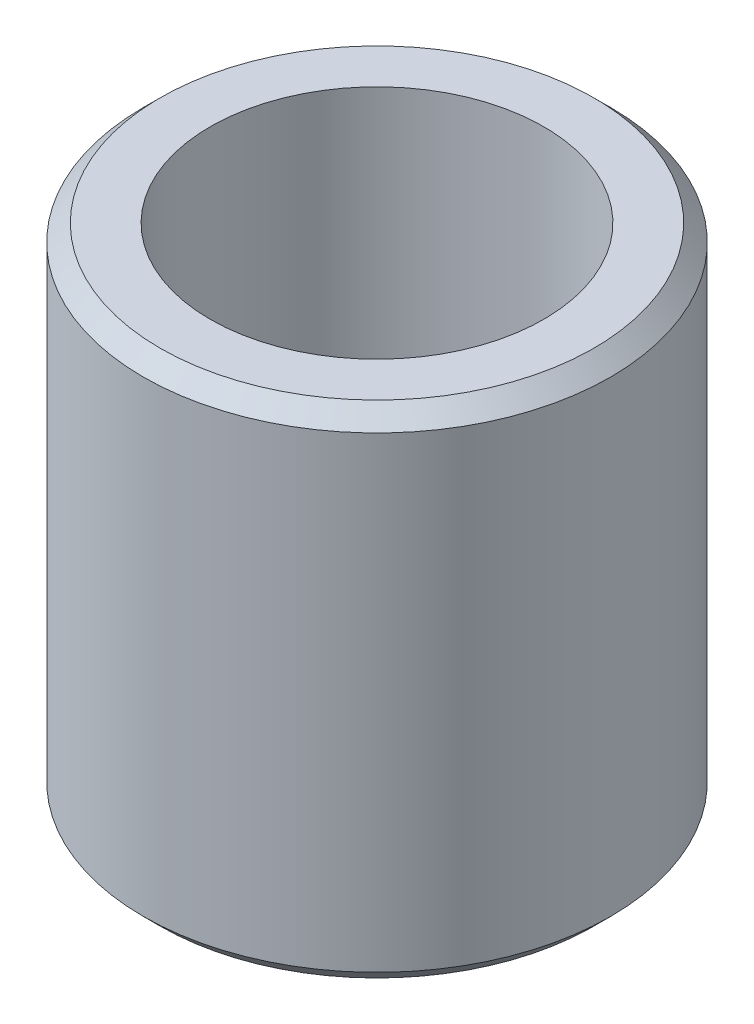
ISO-10303-21;
HEADER;
FILE_DESCRIPTION(('STEP AP214'),'2;1');
FILE_NAME('part.step','',(''),(''),'','','');
FILE_SCHEMA(('AUTOMOTIVE_DESIGN { 1 0 10303 214 1 1 1 1 }'));
ENDSEC;
DATA;
#1=APPLICATION_CONTEXT('core data for automotive mechanical design processes');
#2=APPLICATION_PROTOCOL_DEFINITION('international standard','automotive_design',2000,#1);
#3=PRODUCT_CONTEXT('',#1,'mechanical');
#4=PRODUCT('Part','Part','',(#3));
#5=PRODUCT_RELATED_PRODUCT_CATEGORY('part','',(#4));
#6=PRODUCT_DEFINITION_FORMATION('','',#4);
#7=PRODUCT_DEFINITION_CONTEXT('part definition',#1,'design');
#8=PRODUCT_DEFINITION('design','',#6,#7);
#9=PRODUCT_DEFINITION_SHAPE('','',#8);
#10=(LENGTH_UNIT() NAMED_UNIT(*) SI_UNIT(.MILLI.,.METRE.));
#11=(NAMED_UNIT(*) PLANE_ANGLE_UNIT() SI_UNIT($,.RADIAN.));
#12=(NAMED_UNIT(*) SI_UNIT($,.STERADIAN.) SOLID_ANGLE_UNIT());
#13=UNCERTAINTY_MEASURE_WITH_UNIT(LENGTH_MEASURE(1.E-05),#10,'distance_accuracy_value','');
#14=(GEOMETRIC_REPRESENTATION_CONTEXT(3) GLOBAL_UNCERTAINTY_ASSIGNED_CONTEXT((#13)) GLOBAL_UNIT_ASSIGNED_CONTEXT((#10,
#11,#12)) REPRESENTATION_CONTEXT('',''));
#15=CARTESIAN_POINT('',(0.,0.,0.));
#16=DIRECTION('',(0.,0.,1.));
#17=DIRECTION('',(1.,0.,0.));
#18=AXIS2_PLACEMENT_3D('',#15,#16,#17);
#19=CARTESIAN_POINT('',(0.,7.5,0.));
#20=DIRECTION('',(0.,1.,0.));
#21=DIRECTION('',(0.,0.,1.));
#22=AXIS2_PLACEMENT_3D('',#19,#20,#21);
#23=PLANE('',#22);
#24=CARTESIAN_POINT('',(0.,7.5,0.));
#25=DIRECTION('',(0.,1.,0.));
#26=DIRECTION('',(0.,0.,1.));
#27=AXIS2_PLACEMENT_3D('',#24,#25,#26);
#28=CIRCLE('',#27,6.5);
#29=CARTESIAN_POINT('',(0.,7.5,6.5));
#30=VERTEX_POINT('',#29);
#31=EDGE_CURVE('E10',#30,#30,#28,.T.);
#32=ORIENTED_EDGE('',*,*,#31,.T.);
#33=EDGE_LOOP('',(#32));
#34=FACE_BOUND('',#33,.T.);
#35=CARTESIAN_POINT('',(0.,7.5,0.));
#36=DIRECTION('',(0.,1.,0.));
#37=DIRECTION('',(0.,0.,1.));
#38=AXIS2_PLACEMENT_3D('',#35,#36,#37);
#39=CIRCLE('',#38,5.);
#40=CARTESIAN_POINT('',(0.,7.5,5.));
#41=VERTEX_POINT('',#40);
#42=EDGE_CURVE('E67',#41,#41,#39,.T.);
#43=ORIENTED_EDGE('',*,*,#42,.F.);
#44=EDGE_LOOP('',(#43));
#45=FACE_BOUND('',#44,.T.);
#46=ADVANCED_FACE('F44',(#34,#45),#23,.T.);
#47=CARTESIAN_POINT('',(0.,-7.5,0.));
#48=DIRECTION('',(0.,1.,0.));
#49=DIRECTION('',(0.,0.,1.));
#50=AXIS2_PLACEMENT_3D('',#47,#48,#49);
#51=PLANE('',#50);
#52=CARTESIAN_POINT('',(0.,-7.5,0.));
#53=DIRECTION('',(0.,1.,0.));
#54=DIRECTION('',(0.,0.,1.));
#55=AXIS2_PLACEMENT_3D('',#52,#53,#54);
#56=CIRCLE('',#55,6.5);
#57=CARTESIAN_POINT('',(0.,-7.5,6.5));
#58=VERTEX_POINT('',#57);
#59=EDGE_CURVE('E53',#58,#58,#56,.F.);
#60=ORIENTED_EDGE('',*,*,#59,.T.);
#61=EDGE_LOOP('',(#60));
#62=FACE_BOUND('',#61,.T.);
#63=CARTESIAN_POINT('',(0.,-7.5,0.));
#64=DIRECTION('',(0.,1.,0.));
#65=DIRECTION('',(0.,0.,1.));
#66=AXIS2_PLACEMENT_3D('',#63,#64,#65);
#67=CIRCLE('',#66,5.);
#68=CARTESIAN_POINT('',(0.,-7.5,5.));
#69=VERTEX_POINT('',#68);
#70=EDGE_CURVE('E72',#69,#69,#67,.T.);
#71=ORIENTED_EDGE('',*,*,#70,.T.);
#72=EDGE_LOOP('',(#71));
#73=FACE_BOUND('',#72,.T.);
#74=ADVANCED_FACE('F85',(#62,#73),#51,.F.);
#75=CARTESIAN_POINT('',(0.,7.5,0.));
#76=DIRECTION('',(0.,-1.,0.));
#77=DIRECTION('',(0.,0.,-1.));
#78=AXIS2_PLACEMENT_3D('',#75,#76,#77);
#79=CYLINDRICAL_SURFACE('',#78,7.);
#80=CARTESIAN_POINT('',(0.,-7.,0.));
#81=DIRECTION('',(0.,1.,0.));
#82=DIRECTION('',(0.,0.,1.));
#83=AXIS2_PLACEMENT_3D('',#80,#81,#82);
#84=CIRCLE('',#83,7.);
#85=CARTESIAN_POINT('',(0.,-7.,7.));
#86=VERTEX_POINT('',#85);
#87=EDGE_CURVE('E56',#86,#86,#84,.T.);
#88=ORIENTED_EDGE('',*,*,#87,.T.);
#89=EDGE_LOOP('',(#88));
#90=FACE_BOUND('',#89,.T.);
#91=CARTESIAN_POINT('',(0.,7.,0.));
#92=DIRECTION('',(0.,1.,0.));
#93=DIRECTION('',(0.,0.,1.));
#94=AXIS2_PLACEMENT_3D('',#91,#92,#93);
#95=CIRCLE('',#94,7.);
#96=CARTESIAN_POINT('',(0.,7.,7.));
#97=VERTEX_POINT('',#96);
#98=EDGE_CURVE('E61',#97,#97,#95,.F.);
#99=ORIENTED_EDGE('',*,*,#98,.T.);
#100=EDGE_LOOP('',(#99));
#101=FACE_BOUND('',#100,.T.);
#102=ADVANCED_FACE('F90',(#90,#101),#79,.T.);
#103=CARTESIAN_POINT('',(0.,7.5,0.));
#104=DIRECTION('',(0.,-1.,0.));
#105=DIRECTION('',(0.,0.,-1.));
#106=AXIS2_PLACEMENT_3D('',#103,#104,#105);
#107=CYLINDRICAL_SURFACE('',#106,5.);
#108=ORIENTED_EDGE('',*,*,#42,.T.);
#109=EDGE_LOOP('',(#108));
#110=FACE_BOUND('',#109,.T.);
#111=ORIENTED_EDGE('',*,*,#70,.F.);
#112=EDGE_LOOP('',(#111));
#113=FACE_BOUND('',#112,.T.);
#114=ADVANCED_FACE('F76',(#110,#113),#107,.F.);
#115=CARTESIAN_POINT('',(0.,-7.,0.));
#116=DIRECTION('',(0.,1.,0.));
#117=DIRECTION('',(0.,0.,1.));
#118=AXIS2_PLACEMENT_3D('',#115,#116,#117);
#119=CONICAL_SURFACE('',#118,7.,0.785398163397447);
#120=ORIENTED_EDGE('',*,*,#59,.F.);
#121=EDGE_LOOP('',(#120));
#122=FACE_BOUND('',#121,.T.);
#123=ORIENTED_EDGE('',*,*,#87,.F.);
#124=EDGE_LOOP('',(#123));
#125=FACE_BOUND('',#124,.T.);
#126=ADVANCED_FACE('F96',(#122,#125),#119,.T.);
#127=CARTESIAN_POINT('',(0.,7.5,0.));
#128=DIRECTION('',(0.,-1.,0.));
#129=DIRECTION('',(0.,0.,-1.));
#130=AXIS2_PLACEMENT_3D('',#127,#128,#129);
#131=CONICAL_SURFACE('',#130,6.5,0.785398163397445);
#132=ORIENTED_EDGE('',*,*,#98,.F.);
#133=EDGE_LOOP('',(#132));
#134=FACE_BOUND('',#133,.T.);
#135=ORIENTED_EDGE('',*,*,#31,.F.);
#136=EDGE_LOOP('',(#135));
#137=FACE_BOUND('',#136,.T.);
#138=ADVANCED_FACE('F48',(#134,#137),#131,.T.);
#139=CLOSED_SHELL('',(#46,#74,#102,#114,#126,#138));
#140=MANIFOLD_SOLID_BREP('B2',#139);
#141=ADVANCED_BREP_SHAPE_REPRESENTATION('',(#18,#140),#14);
#142=SHAPE_DEFINITION_REPRESENTATION(#9,#141);
ENDSEC;
END-ISO-10303-21;
